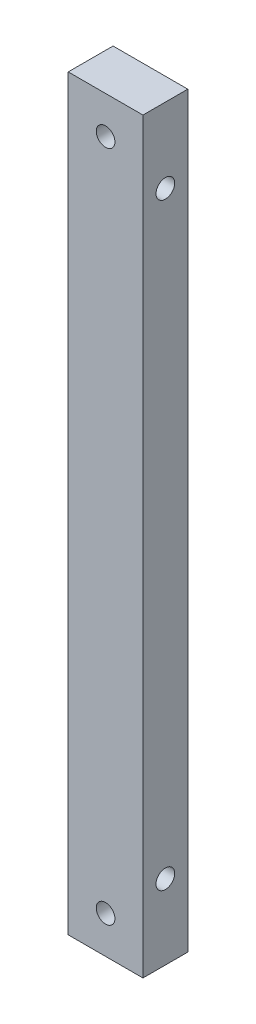
ISO-10303-21;
HEADER;
FILE_DESCRIPTION(('STEP AP214'),'2;1');
FILE_NAME('part.step','',(''),(''),'','','');
FILE_SCHEMA(('AUTOMOTIVE_DESIGN { 1 0 10303 214 1 1 1 1 }'));
ENDSEC;
DATA;
#1=APPLICATION_CONTEXT('core data for automotive mechanical design processes');
#2=APPLICATION_PROTOCOL_DEFINITION('international standard','automotive_design',2000,#1);
#3=PRODUCT_CONTEXT('',#1,'mechanical');
#4=PRODUCT('Part','Part','',(#3));
#5=PRODUCT_RELATED_PRODUCT_CATEGORY('part','',(#4));
#6=PRODUCT_DEFINITION_FORMATION('','',#4);
#7=PRODUCT_DEFINITION_CONTEXT('part definition',#1,'design');
#8=PRODUCT_DEFINITION('design','',#6,#7);
#9=PRODUCT_DEFINITION_SHAPE('','',#8);
#10=(LENGTH_UNIT() NAMED_UNIT(*) SI_UNIT(.MILLI.,.METRE.));
#11=(NAMED_UNIT(*) PLANE_ANGLE_UNIT() SI_UNIT($,.RADIAN.));
#12=(NAMED_UNIT(*) SI_UNIT($,.STERADIAN.) SOLID_ANGLE_UNIT());
#13=UNCERTAINTY_MEASURE_WITH_UNIT(LENGTH_MEASURE(1.E-05),#10,'distance_accuracy_value','');
#14=(GEOMETRIC_REPRESENTATION_CONTEXT(3) GLOBAL_UNCERTAINTY_ASSIGNED_CONTEXT((#13)) GLOBAL_UNIT_ASSIGNED_CONTEXT((#10,
#11,#12)) REPRESENTATION_CONTEXT('',''));
#15=CARTESIAN_POINT('',(0.,0.,0.));
#16=DIRECTION('',(0.,0.,1.));
#17=DIRECTION('',(1.,0.,0.));
#18=AXIS2_PLACEMENT_3D('',#15,#16,#17);
#19=CARTESIAN_POINT('',(5.,-50.,0.));
#20=DIRECTION('',(1.,0.,0.));
#21=DIRECTION('',(0.,0.,-1.));
#22=AXIS2_PLACEMENT_3D('',#19,#20,#21);
#23=PLANE('',#22);
#24=CARTESIAN_POINT('',(5.,40.,3.));
#25=DIRECTION('',(1.,0.,0.));
#26=DIRECTION('',(0.,0.,-1.));
#27=AXIS2_PLACEMENT_3D('',#24,#25,#26);
#28=CIRCLE('',#27,1.24999999999998);
#29=CARTESIAN_POINT('',(5.,40.,1.75000000000002));
#30=VERTEX_POINT('',#29);
#31=EDGE_CURVE('E156',#30,#30,#28,.T.);
#32=ORIENTED_EDGE('',*,*,#31,.F.);
#33=EDGE_LOOP('',(#32));
#34=FACE_BOUND('',#33,.T.);
#35=CARTESIAN_POINT('',(5.,-40.,3.));
#36=DIRECTION('',(1.,0.,0.));
#37=DIRECTION('',(0.,0.,-1.));
#38=AXIS2_PLACEMENT_3D('',#35,#36,#37);
#39=CIRCLE('',#38,1.24999999999998);
#40=CARTESIAN_POINT('',(5.,-40.,1.75000000000002));
#41=VERTEX_POINT('',#40);
#42=EDGE_CURVE('E158',#41,#41,#39,.T.);
#43=ORIENTED_EDGE('',*,*,#42,.F.);
#44=EDGE_LOOP('',(#43));
#45=FACE_BOUND('',#44,.T.);
#46=DIRECTION('',(0.,1.,0.));
#47=VECTOR('',#46,1.);
#48=CARTESIAN_POINT('',(5.,-50.,6.));
#49=LINE('',#48,#47);
#50=CARTESIAN_POINT('',(5.,-50.,6.));
#51=VERTEX_POINT('',#50);
#52=CARTESIAN_POINT('',(5.,50.,6.));
#53=VERTEX_POINT('',#52);
#54=EDGE_CURVE('E98',#51,#53,#49,.T.);
#55=ORIENTED_EDGE('',*,*,#54,.F.);
#56=DIRECTION('',(0.,0.,1.));
#57=VECTOR('',#56,1.);
#58=CARTESIAN_POINT('',(5.,-50.,0.));
#59=LINE('',#58,#57);
#60=CARTESIAN_POINT('',(5.,-50.,0.));
#61=VERTEX_POINT('',#60);
#62=EDGE_CURVE('E11',#61,#51,#59,.T.);
#63=ORIENTED_EDGE('',*,*,#62,.F.);
#64=DIRECTION('',(0.,1.,0.));
#65=VECTOR('',#64,1.);
#66=CARTESIAN_POINT('',(5.,-50.,0.));
#67=LINE('',#66,#65);
#68=CARTESIAN_POINT('',(5.,50.,0.));
#69=VERTEX_POINT('',#68);
#70=EDGE_CURVE('E91',#61,#69,#67,.T.);
#71=ORIENTED_EDGE('',*,*,#70,.T.);
#72=DIRECTION('',(0.,0.,1.));
#73=VECTOR('',#72,1.);
#74=CARTESIAN_POINT('',(5.,50.,0.));
#75=LINE('',#74,#73);
#76=EDGE_CURVE('E36',#69,#53,#75,.T.);
#77=ORIENTED_EDGE('',*,*,#76,.T.);
#78=EDGE_LOOP('',(#55,#63,#71,#77));
#79=FACE_BOUND('',#78,.T.);
#80=ADVANCED_FACE('F33',(#34,#45,#79),#23,.T.);
#81=CARTESIAN_POINT('',(-5.,-50.,0.));
#82=DIRECTION('',(0.,-1.,0.));
#83=DIRECTION('',(0.,0.,-1.));
#84=AXIS2_PLACEMENT_3D('',#81,#82,#83);
#85=PLANE('',#84);
#86=DIRECTION('',(1.,0.,0.));
#87=VECTOR('',#86,1.);
#88=CARTESIAN_POINT('',(-5.,-50.,6.));
#89=LINE('',#88,#87);
#90=CARTESIAN_POINT('',(-5.,-50.,6.));
#91=VERTEX_POINT('',#90);
#92=EDGE_CURVE('E93',#91,#51,#89,.T.);
#93=ORIENTED_EDGE('',*,*,#92,.F.);
#94=DIRECTION('',(0.,0.,1.));
#95=VECTOR('',#94,1.);
#96=CARTESIAN_POINT('',(-5.,-50.,0.));
#97=LINE('',#96,#95);
#98=CARTESIAN_POINT('',(-5.,-50.,0.));
#99=VERTEX_POINT('',#98);
#100=EDGE_CURVE('E42',#99,#91,#97,.T.);
#101=ORIENTED_EDGE('',*,*,#100,.F.);
#102=DIRECTION('',(1.,0.,0.));
#103=VECTOR('',#102,1.);
#104=CARTESIAN_POINT('',(-5.,-50.,0.));
#105=LINE('',#104,#103);
#106=EDGE_CURVE('E88',#99,#61,#105,.T.);
#107=ORIENTED_EDGE('',*,*,#106,.T.);
#108=ORIENTED_EDGE('',*,*,#62,.T.);
#109=EDGE_LOOP('',(#93,#101,#107,#108));
#110=FACE_BOUND('',#109,.T.);
#111=ADVANCED_FACE('F109',(#110),#85,.T.);
#112=CARTESIAN_POINT('',(-5.,50.,0.));
#113=DIRECTION('',(-1.,0.,0.));
#114=DIRECTION('',(0.,0.,1.));
#115=AXIS2_PLACEMENT_3D('',#112,#113,#114);
#116=PLANE('',#115);
#117=CARTESIAN_POINT('',(-4.99999999999999,40.,3.));
#118=DIRECTION('',(1.,0.,0.));
#119=DIRECTION('',(0.,0.,-1.));
#120=AXIS2_PLACEMENT_3D('',#117,#118,#119);
#121=CIRCLE('',#120,1.24999999999998);
#122=CARTESIAN_POINT('',(-4.99999999999999,40.,1.75000000000002));
#123=VERTEX_POINT('',#122);
#124=EDGE_CURVE('E153',#123,#123,#121,.T.);
#125=ORIENTED_EDGE('',*,*,#124,.T.);
#126=EDGE_LOOP('',(#125));
#127=FACE_BOUND('',#126,.T.);
#128=CARTESIAN_POINT('',(-4.99999999999999,-40.,3.));
#129=DIRECTION('',(1.,0.,0.));
#130=DIRECTION('',(0.,0.,-1.));
#131=AXIS2_PLACEMENT_3D('',#128,#129,#130);
#132=CIRCLE('',#131,1.24999999999998);
#133=CARTESIAN_POINT('',(-4.99999999999999,-40.,1.75000000000002));
#134=VERTEX_POINT('',#133);
#135=EDGE_CURVE('E163',#134,#134,#132,.T.);
#136=ORIENTED_EDGE('',*,*,#135,.T.);
#137=EDGE_LOOP('',(#136));
#138=FACE_BOUND('',#137,.T.);
#139=DIRECTION('',(0.,-1.,0.));
#140=VECTOR('',#139,1.);
#141=CARTESIAN_POINT('',(-5.,50.,6.));
#142=LINE('',#141,#140);
#143=CARTESIAN_POINT('',(-5.,50.,6.));
#144=VERTEX_POINT('',#143);
#145=EDGE_CURVE('E83',#144,#91,#142,.T.);
#146=ORIENTED_EDGE('',*,*,#145,.F.);
#147=DIRECTION('',(0.,0.,1.));
#148=VECTOR('',#147,1.);
#149=CARTESIAN_POINT('',(-5.,50.,0.));
#150=LINE('',#149,#148);
#151=CARTESIAN_POINT('',(-5.,50.,0.));
#152=VERTEX_POINT('',#151);
#153=EDGE_CURVE('E78',#152,#144,#150,.T.);
#154=ORIENTED_EDGE('',*,*,#153,.F.);
#155=DIRECTION('',(0.,-1.,0.));
#156=VECTOR('',#155,1.);
#157=CARTESIAN_POINT('',(-5.,50.,0.));
#158=LINE('',#157,#156);
#159=EDGE_CURVE('E81',#152,#99,#158,.T.);
#160=ORIENTED_EDGE('',*,*,#159,.T.);
#161=ORIENTED_EDGE('',*,*,#100,.T.);
#162=EDGE_LOOP('',(#146,#154,#160,#161));
#163=FACE_BOUND('',#162,.T.);
#164=ADVANCED_FACE('F80',(#127,#138,#163),#116,.T.);
#165=CARTESIAN_POINT('',(5.,50.,0.));
#166=DIRECTION('',(0.,1.,0.));
#167=DIRECTION('',(0.,0.,1.));
#168=AXIS2_PLACEMENT_3D('',#165,#166,#167);
#169=PLANE('',#168);
#170=DIRECTION('',(-1.,0.,0.));
#171=VECTOR('',#170,1.);
#172=CARTESIAN_POINT('',(5.,50.,6.));
#173=LINE('',#172,#171);
#174=EDGE_CURVE('E101',#53,#144,#173,.T.);
#175=ORIENTED_EDGE('',*,*,#174,.F.);
#176=ORIENTED_EDGE('',*,*,#76,.F.);
#177=DIRECTION('',(-1.,0.,0.));
#178=VECTOR('',#177,1.);
#179=CARTESIAN_POINT('',(5.,50.,0.));
#180=LINE('',#179,#178);
#181=EDGE_CURVE('E87',#69,#152,#180,.T.);
#182=ORIENTED_EDGE('',*,*,#181,.T.);
#183=ORIENTED_EDGE('',*,*,#153,.T.);
#184=EDGE_LOOP('',(#175,#176,#182,#183));
#185=FACE_BOUND('',#184,.T.);
#186=ADVANCED_FACE('F90',(#185),#169,.T.);
#187=CARTESIAN_POINT('',(0.,0.,0.));
#188=DIRECTION('',(0.,0.,1.));
#189=DIRECTION('',(1.,0.,0.));
#190=AXIS2_PLACEMENT_3D('',#187,#188,#189);
#191=PLANE('',#190);
#192=CARTESIAN_POINT('',(0.,45.,0.));
#193=DIRECTION('',(0.,0.,1.));
#194=DIRECTION('',(1.,0.,0.));
#195=AXIS2_PLACEMENT_3D('',#192,#193,#194);
#196=CIRCLE('',#195,1.24999999999998);
#197=CARTESIAN_POINT('',(1.24999999999998,45.,0.));
#198=VERTEX_POINT('',#197);
#199=EDGE_CURVE('E169',#198,#198,#196,.T.);
#200=ORIENTED_EDGE('',*,*,#199,.T.);
#201=EDGE_LOOP('',(#200));
#202=FACE_BOUND('',#201,.T.);
#203=CARTESIAN_POINT('',(0.,-45.,0.));
#204=DIRECTION('',(0.,0.,1.));
#205=DIRECTION('',(1.,0.,0.));
#206=AXIS2_PLACEMENT_3D('',#203,#204,#205);
#207=CIRCLE('',#206,1.24999999999998);
#208=CARTESIAN_POINT('',(1.24999999999998,-45.,0.));
#209=VERTEX_POINT('',#208);
#210=EDGE_CURVE('E102',#209,#209,#207,.T.);
#211=ORIENTED_EDGE('',*,*,#210,.T.);
#212=EDGE_LOOP('',(#211));
#213=FACE_BOUND('',#212,.T.);
#214=ORIENTED_EDGE('',*,*,#70,.F.);
#215=ORIENTED_EDGE('',*,*,#106,.F.);
#216=ORIENTED_EDGE('',*,*,#159,.F.);
#217=ORIENTED_EDGE('',*,*,#181,.F.);
#218=EDGE_LOOP('',(#214,#215,#216,#217));
#219=FACE_BOUND('',#218,.T.);
#220=ADVANCED_FACE('F86',(#202,#213,#219),#191,.F.);
#221=CARTESIAN_POINT('',(0.,0.,6.));
#222=DIRECTION('',(0.,0.,1.));
#223=DIRECTION('',(1.,0.,0.));
#224=AXIS2_PLACEMENT_3D('',#221,#222,#223);
#225=PLANE('',#224);
#226=CARTESIAN_POINT('',(0.,45.,6.));
#227=DIRECTION('',(0.,0.,1.));
#228=DIRECTION('',(1.,0.,0.));
#229=AXIS2_PLACEMENT_3D('',#226,#227,#228);
#230=CIRCLE('',#229,1.24999999999999);
#231=CARTESIAN_POINT('',(1.24999999999999,45.,6.));
#232=VERTEX_POINT('',#231);
#233=EDGE_CURVE('E166',#232,#232,#230,.T.);
#234=ORIENTED_EDGE('',*,*,#233,.F.);
#235=EDGE_LOOP('',(#234));
#236=FACE_BOUND('',#235,.T.);
#237=CARTESIAN_POINT('',(0.,-45.,6.));
#238=DIRECTION('',(0.,0.,1.));
#239=DIRECTION('',(1.,0.,0.));
#240=AXIS2_PLACEMENT_3D('',#237,#238,#239);
#241=CIRCLE('',#240,1.24999999999999);
#242=CARTESIAN_POINT('',(1.24999999999999,-45.,6.));
#243=VERTEX_POINT('',#242);
#244=EDGE_CURVE('E171',#243,#243,#241,.T.);
#245=ORIENTED_EDGE('',*,*,#244,.F.);
#246=EDGE_LOOP('',(#245));
#247=FACE_BOUND('',#246,.T.);
#248=ORIENTED_EDGE('',*,*,#54,.T.);
#249=ORIENTED_EDGE('',*,*,#174,.T.);
#250=ORIENTED_EDGE('',*,*,#145,.T.);
#251=ORIENTED_EDGE('',*,*,#92,.T.);
#252=EDGE_LOOP('',(#248,#249,#250,#251));
#253=FACE_BOUND('',#252,.T.);
#254=ADVANCED_FACE('F108',(#236,#247,#253),#225,.T.);
#255=CARTESIAN_POINT('',(0.,-45.,6.));
#256=DIRECTION('',(0.,0.,1.));
#257=DIRECTION('',(1.,0.,0.));
#258=AXIS2_PLACEMENT_3D('',#255,#256,#257);
#259=CYLINDRICAL_SURFACE('',#258,1.24999999999999);
#260=ORIENTED_EDGE('',*,*,#210,.F.);
#261=EDGE_LOOP('',(#260));
#262=FACE_BOUND('',#261,.T.);
#263=ORIENTED_EDGE('',*,*,#244,.T.);
#264=EDGE_LOOP('',(#263));
#265=FACE_BOUND('',#264,.T.);
#266=ADVANCED_FACE('F129',(#262,#265),#259,.F.);
#267=CARTESIAN_POINT('',(0.,45.,6.));
#268=DIRECTION('',(0.,0.,1.));
#269=DIRECTION('',(1.,0.,0.));
#270=AXIS2_PLACEMENT_3D('',#267,#268,#269);
#271=CYLINDRICAL_SURFACE('',#270,1.24999999999999);
#272=ORIENTED_EDGE('',*,*,#199,.F.);
#273=EDGE_LOOP('',(#272));
#274=FACE_BOUND('',#273,.T.);
#275=ORIENTED_EDGE('',*,*,#233,.T.);
#276=EDGE_LOOP('',(#275));
#277=FACE_BOUND('',#276,.T.);
#278=ADVANCED_FACE('F136',(#274,#277),#271,.F.);
#279=CARTESIAN_POINT('',(5.,-40.,3.));
#280=DIRECTION('',(1.,0.,0.));
#281=DIRECTION('',(0.,0.,-1.));
#282=AXIS2_PLACEMENT_3D('',#279,#280,#281);
#283=CYLINDRICAL_SURFACE('',#282,1.24999999999998);
#284=ORIENTED_EDGE('',*,*,#135,.F.);
#285=EDGE_LOOP('',(#284));
#286=FACE_BOUND('',#285,.T.);
#287=ORIENTED_EDGE('',*,*,#42,.T.);
#288=EDGE_LOOP('',(#287));
#289=FACE_BOUND('',#288,.T.);
#290=ADVANCED_FACE('F140',(#286,#289),#283,.F.);
#291=CARTESIAN_POINT('',(5.,40.,3.));
#292=DIRECTION('',(1.,0.,0.));
#293=DIRECTION('',(0.,0.,-1.));
#294=AXIS2_PLACEMENT_3D('',#291,#292,#293);
#295=CYLINDRICAL_SURFACE('',#294,1.24999999999998);
#296=ORIENTED_EDGE('',*,*,#124,.F.);
#297=EDGE_LOOP('',(#296));
#298=FACE_BOUND('',#297,.T.);
#299=ORIENTED_EDGE('',*,*,#31,.T.);
#300=EDGE_LOOP('',(#299));
#301=FACE_BOUND('',#300,.T.);
#302=ADVANCED_FACE('F144',(#298,#301),#295,.F.);
#303=CLOSED_SHELL('',(#80,#111,#164,#186,#220,#254,#266,#278,#290,#302));
#304=MANIFOLD_SOLID_BREP('B2',#303);
#305=ADVANCED_BREP_SHAPE_REPRESENTATION('',(#18,#304),#14);
#306=SHAPE_DEFINITION_REPRESENTATION(#9,#305);
ENDSEC;
END-ISO-10303-21;
